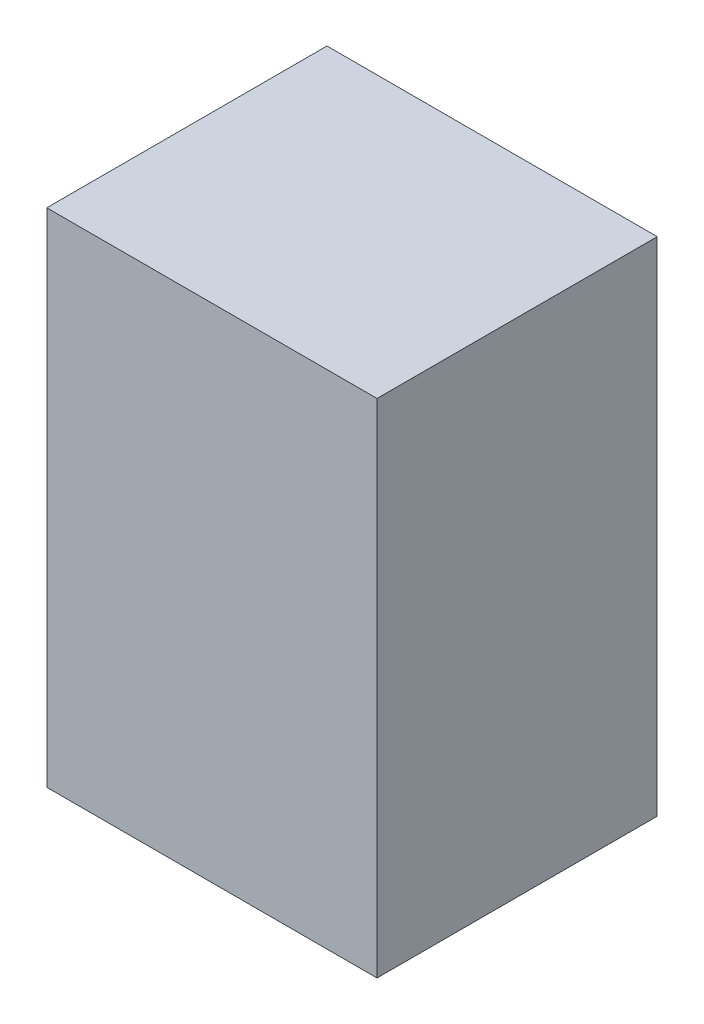
ISO-10303-21;
HEADER;
FILE_DESCRIPTION(('STEP AP214'),'2;1');
FILE_NAME('part.step','',(''),(''),'','','');
FILE_SCHEMA(('AUTOMOTIVE_DESIGN { 1 0 10303 214 1 1 1 1 }'));
ENDSEC;
DATA;
#1=APPLICATION_CONTEXT('core data for automotive mechanical design processes');
#2=APPLICATION_PROTOCOL_DEFINITION('international standard','automotive_design',2000,#1);
#3=PRODUCT_CONTEXT('',#1,'mechanical');
#4=PRODUCT('Part','Part','',(#3));
#5=PRODUCT_RELATED_PRODUCT_CATEGORY('part','',(#4));
#6=PRODUCT_DEFINITION_FORMATION('','',#4);
#7=PRODUCT_DEFINITION_CONTEXT('part definition',#1,'design');
#8=PRODUCT_DEFINITION('design','',#6,#7);
#9=PRODUCT_DEFINITION_SHAPE('','',#8);
#10=(LENGTH_UNIT() NAMED_UNIT(*) SI_UNIT(.MILLI.,.METRE.));
#11=(NAMED_UNIT(*) PLANE_ANGLE_UNIT() SI_UNIT($,.RADIAN.));
#12=(NAMED_UNIT(*) SI_UNIT($,.STERADIAN.) SOLID_ANGLE_UNIT());
#13=UNCERTAINTY_MEASURE_WITH_UNIT(LENGTH_MEASURE(1.E-05),#10,'distance_accuracy_value','');
#14=(GEOMETRIC_REPRESENTATION_CONTEXT(3) GLOBAL_UNCERTAINTY_ASSIGNED_CONTEXT((#13)) GLOBAL_UNIT_ASSIGNED_CONTEXT((#10,
#11,#12)) REPRESENTATION_CONTEXT('',''));
#15=CARTESIAN_POINT('',(0.,0.,0.));
#16=DIRECTION('',(0.,0.,1.));
#17=DIRECTION('',(1.,0.,0.));
#18=AXIS2_PLACEMENT_3D('',#15,#16,#17);
#19=CARTESIAN_POINT('',(33.,-50.15,28.));
#20=DIRECTION('',(-1.,0.,0.));
#21=DIRECTION('',(0.,0.,1.));
#22=AXIS2_PLACEMENT_3D('',#19,#20,#21);
#23=PLANE('',#22);
#24=DIRECTION('',(0.,1.,0.));
#25=VECTOR('',#24,1.);
#26=CARTESIAN_POINT('',(33.,-50.15,-28.));
#27=LINE('',#26,#25);
#28=CARTESIAN_POINT('',(33.,-50.15,-28.));
#29=VERTEX_POINT('',#28);
#30=CARTESIAN_POINT('',(33.,50.15,-28.));
#31=VERTEX_POINT('',#30);
#32=EDGE_CURVE('E96',#29,#31,#27,.T.);
#33=ORIENTED_EDGE('',*,*,#32,.T.);
#34=DIRECTION('',(0.,0.,-1.));
#35=VECTOR('',#34,1.);
#36=CARTESIAN_POINT('',(33.,50.15,28.));
#37=LINE('',#36,#35);
#38=CARTESIAN_POINT('',(33.,50.15,28.));
#39=VERTEX_POINT('',#38);
#40=EDGE_CURVE('E11',#39,#31,#37,.T.);
#41=ORIENTED_EDGE('',*,*,#40,.F.);
#42=DIRECTION('',(0.,1.,0.));
#43=VECTOR('',#42,1.);
#44=CARTESIAN_POINT('',(33.,-50.15,28.));
#45=LINE('',#44,#43);
#46=CARTESIAN_POINT('',(33.,-50.15,28.));
#47=VERTEX_POINT('',#46);
#48=EDGE_CURVE('E84',#47,#39,#45,.T.);
#49=ORIENTED_EDGE('',*,*,#48,.F.);
#50=DIRECTION('',(0.,0.,-1.));
#51=VECTOR('',#50,1.);
#52=CARTESIAN_POINT('',(33.,-50.15,28.));
#53=LINE('',#52,#51);
#54=EDGE_CURVE('E92',#47,#29,#53,.T.);
#55=ORIENTED_EDGE('',*,*,#54,.T.);
#56=EDGE_LOOP('',(#33,#41,#49,#55));
#57=FACE_BOUND('',#56,.T.);
#58=ADVANCED_FACE('F33',(#57),#23,.F.);
#59=CARTESIAN_POINT('',(-33.,50.15,28.));
#60=DIRECTION('',(0.,-1.,0.));
#61=DIRECTION('',(0.,0.,-1.));
#62=AXIS2_PLACEMENT_3D('',#59,#60,#61);
#63=PLANE('',#62);
#64=DIRECTION('',(-1.,0.,0.));
#65=VECTOR('',#64,1.);
#66=CARTESIAN_POINT('',(-33.,50.15,-28.));
#67=LINE('',#66,#65);
#68=CARTESIAN_POINT('',(-33.,50.15,-28.));
#69=VERTEX_POINT('',#68);
#70=EDGE_CURVE('E88',#31,#69,#67,.T.);
#71=ORIENTED_EDGE('',*,*,#70,.T.);
#72=DIRECTION('',(0.,0.,-1.));
#73=VECTOR('',#72,1.);
#74=CARTESIAN_POINT('',(-33.,50.15,28.));
#75=LINE('',#74,#73);
#76=CARTESIAN_POINT('',(-33.,50.15,28.));
#77=VERTEX_POINT('',#76);
#78=EDGE_CURVE('E41',#77,#69,#75,.T.);
#79=ORIENTED_EDGE('',*,*,#78,.F.);
#80=DIRECTION('',(-1.,0.,0.));
#81=VECTOR('',#80,1.);
#82=CARTESIAN_POINT('',(-33.,50.15,28.));
#83=LINE('',#82,#81);
#84=EDGE_CURVE('E79',#39,#77,#83,.T.);
#85=ORIENTED_EDGE('',*,*,#84,.F.);
#86=ORIENTED_EDGE('',*,*,#40,.T.);
#87=EDGE_LOOP('',(#71,#79,#85,#86));
#88=FACE_BOUND('',#87,.T.);
#89=ADVANCED_FACE('F87',(#88),#63,.F.);
#90=CARTESIAN_POINT('',(-33.,-50.15,28.));
#91=DIRECTION('',(1.,0.,0.));
#92=DIRECTION('',(0.,0.,-1.));
#93=AXIS2_PLACEMENT_3D('',#90,#91,#92);
#94=PLANE('',#93);
#95=DIRECTION('',(0.,-1.,0.));
#96=VECTOR('',#95,1.);
#97=CARTESIAN_POINT('',(-33.,-50.15,-28.));
#98=LINE('',#97,#96);
#99=CARTESIAN_POINT('',(-33.,-50.15,-28.));
#100=VERTEX_POINT('',#99);
#101=EDGE_CURVE('E66',#69,#100,#98,.T.);
#102=ORIENTED_EDGE('',*,*,#101,.T.);
#103=DIRECTION('',(0.,0.,-1.));
#104=VECTOR('',#103,1.);
#105=CARTESIAN_POINT('',(-33.,-50.15,28.));
#106=LINE('',#105,#104);
#107=CARTESIAN_POINT('',(-33.,-50.15,28.));
#108=VERTEX_POINT('',#107);
#109=EDGE_CURVE('E89',#108,#100,#106,.T.);
#110=ORIENTED_EDGE('',*,*,#109,.F.);
#111=DIRECTION('',(0.,-1.,0.));
#112=VECTOR('',#111,1.);
#113=CARTESIAN_POINT('',(-33.,-50.15,28.));
#114=LINE('',#113,#112);
#115=EDGE_CURVE('E82',#77,#108,#114,.T.);
#116=ORIENTED_EDGE('',*,*,#115,.F.);
#117=ORIENTED_EDGE('',*,*,#78,.T.);
#118=EDGE_LOOP('',(#102,#110,#116,#117));
#119=FACE_BOUND('',#118,.T.);
#120=ADVANCED_FACE('F90',(#119),#94,.F.);
#121=CARTESIAN_POINT('',(-33.,-50.15,28.));
#122=DIRECTION('',(0.,1.,0.));
#123=DIRECTION('',(0.,0.,1.));
#124=AXIS2_PLACEMENT_3D('',#121,#122,#123);
#125=PLANE('',#124);
#126=DIRECTION('',(1.,0.,0.));
#127=VECTOR('',#126,1.);
#128=CARTESIAN_POINT('',(-33.,-50.15,-28.));
#129=LINE('',#128,#127);
#130=EDGE_CURVE('E72',#100,#29,#129,.T.);
#131=ORIENTED_EDGE('',*,*,#130,.T.);
#132=ORIENTED_EDGE('',*,*,#54,.F.);
#133=DIRECTION('',(1.,0.,0.));
#134=VECTOR('',#133,1.);
#135=CARTESIAN_POINT('',(-33.,-50.15,28.));
#136=LINE('',#135,#134);
#137=EDGE_CURVE('E49',#108,#47,#136,.T.);
#138=ORIENTED_EDGE('',*,*,#137,.F.);
#139=ORIENTED_EDGE('',*,*,#109,.T.);
#140=EDGE_LOOP('',(#131,#132,#138,#139));
#141=FACE_BOUND('',#140,.T.);
#142=ADVANCED_FACE('F103',(#141),#125,.F.);
#143=CARTESIAN_POINT('',(0.,0.,28.));
#144=DIRECTION('',(0.,0.,-1.));
#145=DIRECTION('',(-1.,0.,0.));
#146=AXIS2_PLACEMENT_3D('',#143,#144,#145);
#147=PLANE('',#146);
#148=ORIENTED_EDGE('',*,*,#48,.T.);
#149=ORIENTED_EDGE('',*,*,#84,.T.);
#150=ORIENTED_EDGE('',*,*,#115,.T.);
#151=ORIENTED_EDGE('',*,*,#137,.T.);
#152=EDGE_LOOP('',(#148,#149,#150,#151));
#153=FACE_BOUND('',#152,.T.);
#154=ADVANCED_FACE('F80',(#153),#147,.F.);
#155=CARTESIAN_POINT('',(0.,0.,-28.));
#156=DIRECTION('',(0.,0.,-1.));
#157=DIRECTION('',(-1.,0.,0.));
#158=AXIS2_PLACEMENT_3D('',#155,#156,#157);
#159=PLANE('',#158);
#160=ORIENTED_EDGE('',*,*,#32,.F.);
#161=ORIENTED_EDGE('',*,*,#130,.F.);
#162=ORIENTED_EDGE('',*,*,#101,.F.);
#163=ORIENTED_EDGE('',*,*,#70,.F.);
#164=EDGE_LOOP('',(#160,#161,#162,#163));
#165=FACE_BOUND('',#164,.T.);
#166=ADVANCED_FACE('F106',(#165),#159,.T.);
#167=CLOSED_SHELL('',(#58,#89,#120,#142,#154,#166));
#168=MANIFOLD_SOLID_BREP('B2',#167);
#169=ADVANCED_BREP_SHAPE_REPRESENTATION('',(#18,#168),#14);
#170=SHAPE_DEFINITION_REPRESENTATION(#9,#169);
ENDSEC;
END-ISO-10303-21;
